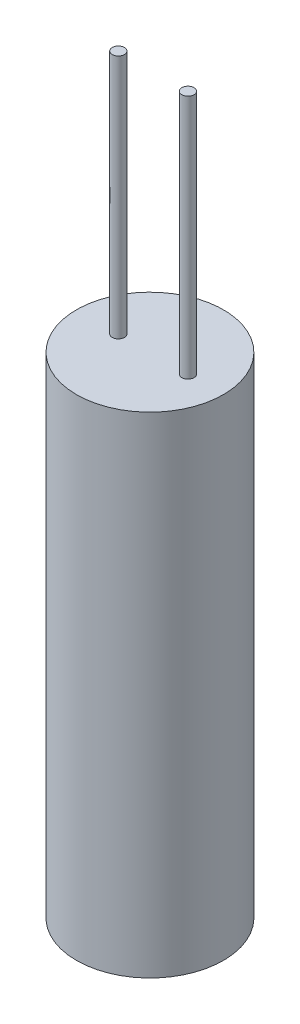
ISO-10303-21;
HEADER;
FILE_DESCRIPTION(('STEP AP214'),'2;1');
FILE_NAME('part.step','',(''),(''),'','','');
FILE_SCHEMA(('AUTOMOTIVE_DESIGN { 1 0 10303 214 1 1 1 1 }'));
ENDSEC;
DATA;
#1=APPLICATION_CONTEXT('core data for automotive mechanical design processes');
#2=APPLICATION_PROTOCOL_DEFINITION('international standard','automotive_design',2000,#1);
#3=PRODUCT_CONTEXT('',#1,'mechanical');
#4=PRODUCT('Part','Part','',(#3));
#5=PRODUCT_RELATED_PRODUCT_CATEGORY('part','',(#4));
#6=PRODUCT_DEFINITION_FORMATION('','',#4);
#7=PRODUCT_DEFINITION_CONTEXT('part definition',#1,'design');
#8=PRODUCT_DEFINITION('design','',#6,#7);
#9=PRODUCT_DEFINITION_SHAPE('','',#8);
#10=(LENGTH_UNIT() NAMED_UNIT(*) SI_UNIT(.MILLI.,.METRE.));
#11=(NAMED_UNIT(*) PLANE_ANGLE_UNIT() SI_UNIT($,.RADIAN.));
#12=(NAMED_UNIT(*) SI_UNIT($,.STERADIAN.) SOLID_ANGLE_UNIT());
#13=UNCERTAINTY_MEASURE_WITH_UNIT(LENGTH_MEASURE(1.E-05),#10,'distance_accuracy_value','');
#14=(GEOMETRIC_REPRESENTATION_CONTEXT(3) GLOBAL_UNCERTAINTY_ASSIGNED_CONTEXT((#13)) GLOBAL_UNIT_ASSIGNED_CONTEXT((#10,
#11,#12)) REPRESENTATION_CONTEXT('',''));
#15=CARTESIAN_POINT('',(0.,0.,0.));
#16=DIRECTION('',(0.,0.,1.));
#17=DIRECTION('',(1.,0.,0.));
#18=AXIS2_PLACEMENT_3D('',#15,#16,#17);
#19=CARTESIAN_POINT('',(0.,20.,0.));
#20=DIRECTION('',(0.,-1.,0.));
#21=DIRECTION('',(0.,0.,-1.));
#22=AXIS2_PLACEMENT_3D('',#19,#20,#21);
#23=CYLINDRICAL_SURFACE('',#22,3.);
#24=CARTESIAN_POINT('',(0.,20.,0.));
#25=DIRECTION('',(0.,1.,0.));
#26=DIRECTION('',(0.,0.,1.));
#27=AXIS2_PLACEMENT_3D('',#24,#25,#26);
#28=CIRCLE('',#27,3.);
#29=CARTESIAN_POINT('',(0.,20.,3.));
#30=VERTEX_POINT('',#29);
#31=EDGE_CURVE('E10',#30,#30,#28,.T.);
#32=ORIENTED_EDGE('',*,*,#31,.F.);
#33=EDGE_LOOP('',(#32));
#34=FACE_BOUND('',#33,.T.);
#35=CARTESIAN_POINT('',(0.,0.,0.));
#36=DIRECTION('',(0.,1.,0.));
#37=DIRECTION('',(0.,0.,1.));
#38=AXIS2_PLACEMENT_3D('',#35,#36,#37);
#39=CIRCLE('',#38,3.);
#40=CARTESIAN_POINT('',(0.,0.,3.));
#41=VERTEX_POINT('',#40);
#42=EDGE_CURVE('E40',#41,#41,#39,.T.);
#43=ORIENTED_EDGE('',*,*,#42,.T.);
#44=EDGE_LOOP('',(#43));
#45=FACE_BOUND('',#44,.T.);
#46=ADVANCED_FACE('F37',(#34,#45),#23,.T.);
#47=CARTESIAN_POINT('',(0.,20.,0.));
#48=DIRECTION('',(0.,1.,0.));
#49=DIRECTION('',(0.,0.,1.));
#50=AXIS2_PLACEMENT_3D('',#47,#48,#49);
#51=PLANE('',#50);
#52=CARTESIAN_POINT('',(1.55034731571676,20.,0.));
#53=DIRECTION('',(0.,1.,0.));
#54=DIRECTION('',(0.,0.,1.));
#55=AXIS2_PLACEMENT_3D('',#52,#53,#54);
#56=CIRCLE('',#55,0.25);
#57=CARTESIAN_POINT('',(1.55034731571676,20.,0.25));
#58=VERTEX_POINT('',#57);
#59=EDGE_CURVE('E55',#58,#58,#56,.T.);
#60=ORIENTED_EDGE('',*,*,#59,.F.);
#61=EDGE_LOOP('',(#60));
#62=FACE_BOUND('',#61,.T.);
#63=CARTESIAN_POINT('',(-1.28965268428324,20.,0.));
#64=DIRECTION('',(0.,1.,0.));
#65=DIRECTION('',(0.,0.,1.));
#66=AXIS2_PLACEMENT_3D('',#63,#64,#65);
#67=CIRCLE('',#66,0.25);
#68=CARTESIAN_POINT('',(-1.28965268428324,20.,0.25));
#69=VERTEX_POINT('',#68);
#70=EDGE_CURVE('E49',#69,#69,#67,.T.);
#71=ORIENTED_EDGE('',*,*,#70,.F.);
#72=EDGE_LOOP('',(#71));
#73=FACE_BOUND('',#72,.T.);
#74=ORIENTED_EDGE('',*,*,#31,.T.);
#75=EDGE_LOOP('',(#74));
#76=FACE_BOUND('',#75,.T.);
#77=ADVANCED_FACE('F70',(#62,#73,#76),#51,.T.);
#78=CARTESIAN_POINT('',(0.,0.,0.));
#79=DIRECTION('',(0.,1.,0.));
#80=DIRECTION('',(0.,0.,1.));
#81=AXIS2_PLACEMENT_3D('',#78,#79,#80);
#82=PLANE('',#81);
#83=ORIENTED_EDGE('',*,*,#42,.F.);
#84=EDGE_LOOP('',(#83));
#85=FACE_BOUND('',#84,.T.);
#86=ADVANCED_FACE('F73',(#85),#82,.F.);
#87=CARTESIAN_POINT('',(-1.28965268428324,30.,0.));
#88=DIRECTION('',(0.,-1.,0.));
#89=DIRECTION('',(0.,0.,-1.));
#90=AXIS2_PLACEMENT_3D('',#87,#88,#89);
#91=CYLINDRICAL_SURFACE('',#90,0.25);
#92=CARTESIAN_POINT('',(-1.28965268428324,30.,0.));
#93=DIRECTION('',(0.,1.,0.));
#94=DIRECTION('',(0.,0.,1.));
#95=AXIS2_PLACEMENT_3D('',#92,#93,#94);
#96=CIRCLE('',#95,0.25);
#97=CARTESIAN_POINT('',(-1.28965268428324,30.,0.25));
#98=VERTEX_POINT('',#97);
#99=EDGE_CURVE('E47',#98,#98,#96,.T.);
#100=ORIENTED_EDGE('',*,*,#99,.F.);
#101=EDGE_LOOP('',(#100));
#102=FACE_BOUND('',#101,.T.);
#103=ORIENTED_EDGE('',*,*,#70,.T.);
#104=EDGE_LOOP('',(#103));
#105=FACE_BOUND('',#104,.T.);
#106=ADVANCED_FACE('F77',(#102,#105),#91,.T.);
#107=CARTESIAN_POINT('',(-1.28965268428324,30.,0.));
#108=DIRECTION('',(0.,1.,0.));
#109=DIRECTION('',(0.,0.,1.));
#110=AXIS2_PLACEMENT_3D('',#107,#108,#109);
#111=PLANE('',#110);
#112=ORIENTED_EDGE('',*,*,#99,.T.);
#113=EDGE_LOOP('',(#112));
#114=FACE_BOUND('',#113,.T.);
#115=ADVANCED_FACE('F66',(#114),#111,.T.);
#116=CARTESIAN_POINT('',(1.55034731571676,30.,0.));
#117=DIRECTION('',(0.,-1.,0.));
#118=DIRECTION('',(0.,0.,-1.));
#119=AXIS2_PLACEMENT_3D('',#116,#117,#118);
#120=CYLINDRICAL_SURFACE('',#119,0.25);
#121=CARTESIAN_POINT('',(1.55034731571676,30.,0.));
#122=DIRECTION('',(0.,1.,0.));
#123=DIRECTION('',(0.,0.,1.));
#124=AXIS2_PLACEMENT_3D('',#121,#122,#123);
#125=CIRCLE('',#124,0.25);
#126=CARTESIAN_POINT('',(1.55034731571676,30.,0.25));
#127=VERTEX_POINT('',#126);
#128=EDGE_CURVE('E52',#127,#127,#125,.T.);
#129=ORIENTED_EDGE('',*,*,#128,.F.);
#130=EDGE_LOOP('',(#129));
#131=FACE_BOUND('',#130,.T.);
#132=ORIENTED_EDGE('',*,*,#59,.T.);
#133=EDGE_LOOP('',(#132));
#134=FACE_BOUND('',#133,.T.);
#135=ADVANCED_FACE('F63',(#131,#134),#120,.T.);
#136=CARTESIAN_POINT('',(1.55034731571676,30.,0.));
#137=DIRECTION('',(0.,1.,0.));
#138=DIRECTION('',(0.,0.,1.));
#139=AXIS2_PLACEMENT_3D('',#136,#137,#138);
#140=PLANE('',#139);
#141=ORIENTED_EDGE('',*,*,#128,.T.);
#142=EDGE_LOOP('',(#141));
#143=FACE_BOUND('',#142,.T.);
#144=ADVANCED_FACE('F61',(#143),#140,.T.);
#145=CLOSED_SHELL('',(#46,#77,#86,#106,#115,#135,#144));
#146=MANIFOLD_SOLID_BREP('B2',#145);
#147=ADVANCED_BREP_SHAPE_REPRESENTATION('',(#18,#146),#14);
#148=SHAPE_DEFINITION_REPRESENTATION(#9,#147);
ENDSEC;
END-ISO-10303-21;
